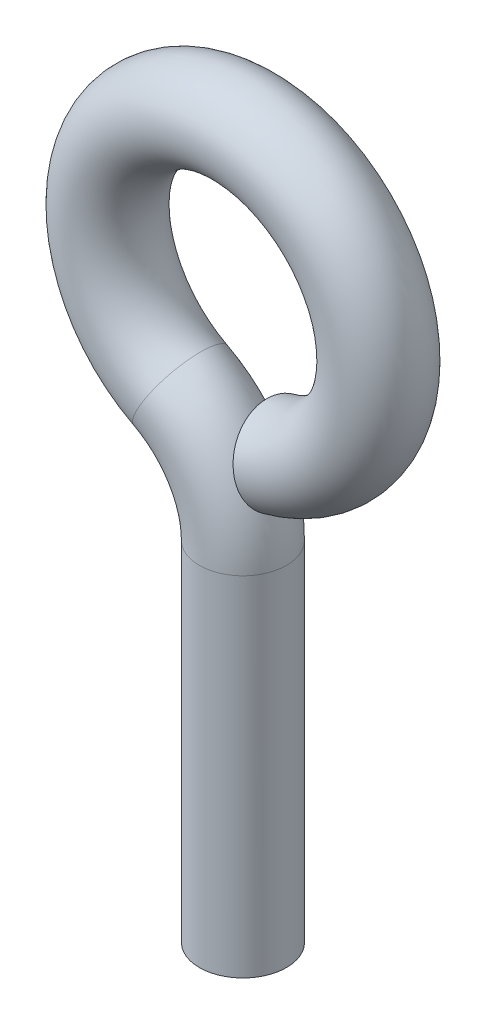
ISO-10303-21;
HEADER;
FILE_DESCRIPTION(('STEP AP214'),'2;1');
FILE_NAME('part.step','',(''),(''),'','','');
FILE_SCHEMA(('AUTOMOTIVE_DESIGN { 1 0 10303 214 1 1 1 1 }'));
ENDSEC;
DATA;
#1=APPLICATION_CONTEXT('core data for automotive mechanical design processes');
#2=APPLICATION_PROTOCOL_DEFINITION('international standard','automotive_design',2000,#1);
#3=PRODUCT_CONTEXT('',#1,'mechanical');
#4=PRODUCT('Part','Part','',(#3));
#5=PRODUCT_RELATED_PRODUCT_CATEGORY('part','',(#4));
#6=PRODUCT_DEFINITION_FORMATION('','',#4);
#7=PRODUCT_DEFINITION_CONTEXT('part definition',#1,'design');
#8=PRODUCT_DEFINITION('design','',#6,#7);
#9=PRODUCT_DEFINITION_SHAPE('','',#8);
#10=(LENGTH_UNIT() NAMED_UNIT(*) SI_UNIT(.MILLI.,.METRE.));
#11=(NAMED_UNIT(*) PLANE_ANGLE_UNIT() SI_UNIT($,.RADIAN.));
#12=(NAMED_UNIT(*) SI_UNIT($,.STERADIAN.) SOLID_ANGLE_UNIT());
#13=UNCERTAINTY_MEASURE_WITH_UNIT(LENGTH_MEASURE(1.E-05),#10,'distance_accuracy_value','');
#14=(GEOMETRIC_REPRESENTATION_CONTEXT(3) GLOBAL_UNCERTAINTY_ASSIGNED_CONTEXT((#13)) GLOBAL_UNIT_ASSIGNED_CONTEXT((#10,
#11,#12)) REPRESENTATION_CONTEXT('',''));
#15=CARTESIAN_POINT('',(0.,0.,0.));
#16=DIRECTION('',(0.,0.,1.));
#17=DIRECTION('',(1.,0.,0.));
#18=AXIS2_PLACEMENT_3D('',#15,#16,#17);
#19=CARTESIAN_POINT('',(0.,0.,0.));
#20=DIRECTION('',(0.,1.,0.));
#21=DIRECTION('',(0.,0.,1.));
#22=AXIS2_PLACEMENT_3D('',#19,#20,#21);
#23=PLANE('',#22);
#24=CARTESIAN_POINT('',(0.,0.,0.));
#25=DIRECTION('',(0.,1.,0.));
#26=DIRECTION('',(0.,0.,1.));
#27=AXIS2_PLACEMENT_3D('',#24,#25,#26);
#28=CIRCLE('',#27,2.25);
#29=CARTESIAN_POINT('',(0.,0.,2.25));
#30=VERTEX_POINT('',#29);
#31=EDGE_CURVE('E54',#30,#30,#28,.T.);
#32=ORIENTED_EDGE('',*,*,#31,.F.);
#33=EDGE_LOOP('',(#32));
#34=FACE_BOUND('',#33,.T.);
#35=ADVANCED_FACE('F37',(#34),#23,.F.);
#36=CARTESIAN_POINT('',(1.81173331571764,22.7803049479536,0.));
#37=DIRECTION('',(-0.965925826289068,-0.258819045102521,0.));
#38=DIRECTION('',(0.,0.,1.));
#39=AXIS2_PLACEMENT_3D('',#36,#37,#38);
#40=PLANE('',#39);
#41=CARTESIAN_POINT('',(1.81173331571764,22.7803049479536,0.));
#42=DIRECTION('',(-0.965925826289068,-0.258819045102521,0.));
#43=DIRECTION('',(0.,0.,1.));
#44=AXIS2_PLACEMENT_3D('',#41,#42,#43);
#45=CIRCLE('',#44,2.25);
#46=CARTESIAN_POINT('',(1.81173331571764,22.7803049479536,2.25));
#47=VERTEX_POINT('',#46);
#48=EDGE_CURVE('E10',#47,#47,#45,.T.);
#49=ORIENTED_EDGE('',*,*,#48,.T.);
#50=EDGE_LOOP('',(#49));
#51=FACE_BOUND('',#50,.T.);
#52=ADVANCED_FACE('F64',(#51),#40,.T.);
#53=CARTESIAN_POINT('',(0.,0.,0.));
#54=DIRECTION('',(0.,1.,0.));
#55=DIRECTION('',(0.,0.,1.));
#56=AXIS2_PLACEMENT_3D('',#53,#54,#55);
#57=CYLINDRICAL_SURFACE('',#56,2.25);
#58=CARTESIAN_POINT('',(0.,18.,0.));
#59=DIRECTION('',(0.,1.,0.));
#60=DIRECTION('',(0.,0.,1.));
#61=AXIS2_PLACEMENT_3D('',#58,#59,#60);
#62=CIRCLE('',#61,2.25);
#63=CARTESIAN_POINT('',(2.25,18.,0.));
#64=VERTEX_POINT('',#63);
#65=EDGE_CURVE('E49',#64,#64,#62,.T.);
#66=ORIENTED_EDGE('',*,*,#65,.F.);
#67=EDGE_LOOP('',(#66));
#68=FACE_BOUND('',#67,.T.);
#69=ORIENTED_EDGE('',*,*,#31,.T.);
#70=EDGE_LOOP('',(#69));
#71=FACE_BOUND('',#70,.T.);
#72=ADVANCED_FACE('F61',(#68,#71),#57,.T.);
#73=CARTESIAN_POINT('',(-6.0152012773478,18.,0.));
#74=DIRECTION('',(0.,0.,1.));
#75=DIRECTION('',(1.,0.,0.));
#76=AXIS2_PLACEMENT_3D('',#73,#74,#75);
#77=TOROIDAL_SURFACE('',#76,6.01520127734781,2.25);
#78=CARTESIAN_POINT('',(-3.23517155395195,23.3342366974144,0.));
#79=DIRECTION('',(-0.886792719223241,0.462167364850278,0.));
#80=DIRECTION('',(0.,0.,1.));
#81=AXIS2_PLACEMENT_3D('',#78,#79,#80);
#82=CIRCLE('',#81,2.25);
#83=CARTESIAN_POINT('',(-2.19529498303882,25.3295203156667,0.));
#84=VERTEX_POINT('',#83);
#85=EDGE_CURVE('E44',#84,#84,#82,.T.);
#86=CARTESIAN_POINT('',(-6.0152012773478,18.,0.));
#87=DIRECTION('',(0.,0.,1.));
#88=DIRECTION('',(1.,0.,0.));
#89=AXIS2_PLACEMENT_3D('',#86,#87,#88);
#90=CIRCLE('',#89,8.26520127734781);
#91=EDGE_CURVE('',#64,#84,#90,.T.);
#92=ORIENTED_EDGE('',*,*,#65,.T.);
#93=ORIENTED_EDGE('',*,*,#85,.F.);
#94=ORIENTED_EDGE('',*,*,#91,.T.);
#95=ORIENTED_EDGE('',*,*,#91,.F.);
#96=EDGE_LOOP('',(#92,#94,#93,#95));
#97=FACE_BOUND('',#96,.T.);
#98=ADVANCED_FACE('F70',(#97),#77,.T.);
#99=CARTESIAN_POINT('',(0.,29.5417857319771,0.));
#100=DIRECTION('',(0.,0.,-1.));
#101=DIRECTION('',(-1.,0.,0.));
#102=AXIS2_PLACEMENT_3D('',#99,#100,#101);
#103=TOROIDAL_SURFACE('',#102,7.,2.25);
#104=ORIENTED_EDGE('',*,*,#48,.F.);
#105=EDGE_LOOP('',(#104));
#106=FACE_BOUND('',#105,.T.);
#107=ORIENTED_EDGE('',*,*,#85,.T.);
#108=EDGE_LOOP('',(#107));
#109=FACE_BOUND('',#108,.T.);
#110=ADVANCED_FACE('F68',(#106,#109),#103,.T.);
#111=CLOSED_SHELL('',(#35,#52,#72,#98,#110));
#112=MANIFOLD_SOLID_BREP('B2',#111);
#113=ADVANCED_BREP_SHAPE_REPRESENTATION('',(#18,#112),#14);
#114=SHAPE_DEFINITION_REPRESENTATION(#9,#113);
ENDSEC;
END-ISO-10303-21;
